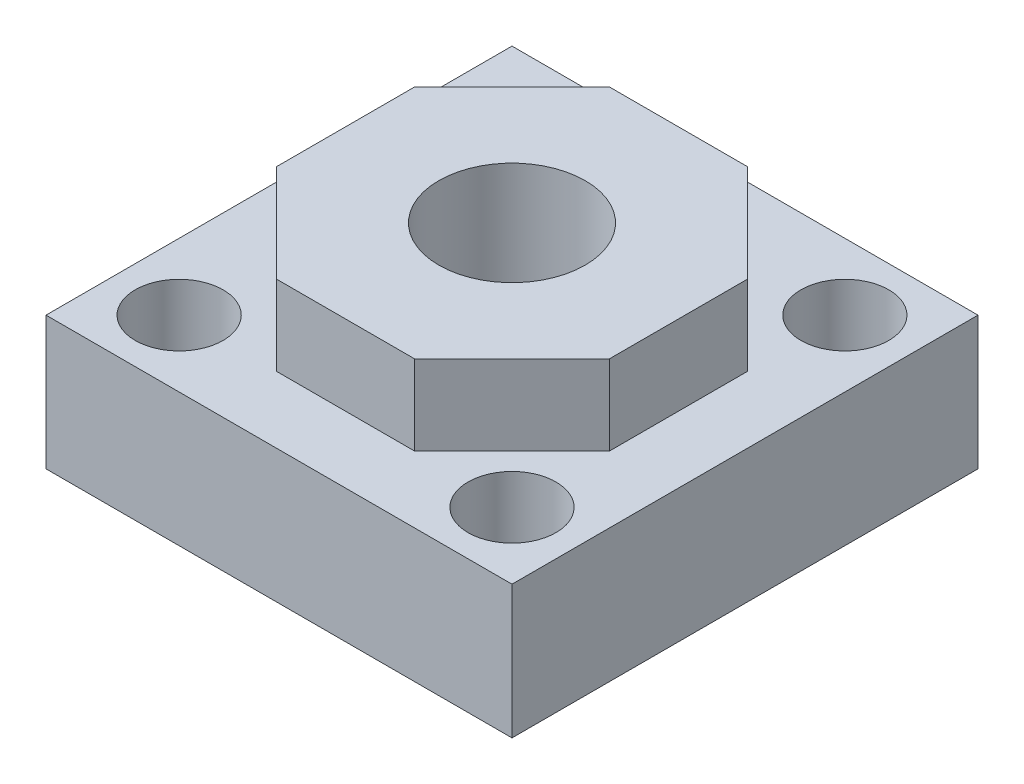
ISO-10303-21;
HEADER;
FILE_DESCRIPTION(('STEP AP214'),'2;1');
FILE_NAME('part.step','',(''),(''),'','','');
FILE_SCHEMA(('AUTOMOTIVE_DESIGN { 1 0 10303 214 1 1 1 1 }'));
ENDSEC;
DATA;
#1=APPLICATION_CONTEXT('core data for automotive mechanical design processes');
#2=APPLICATION_PROTOCOL_DEFINITION('international standard','automotive_design',2000,#1);
#3=PRODUCT_CONTEXT('',#1,'mechanical');
#4=PRODUCT('Part','Part','',(#3));
#5=PRODUCT_RELATED_PRODUCT_CATEGORY('part','',(#4));
#6=PRODUCT_DEFINITION_FORMATION('','',#4);
#7=PRODUCT_DEFINITION_CONTEXT('part definition',#1,'design');
#8=PRODUCT_DEFINITION('design','',#6,#7);
#9=PRODUCT_DEFINITION_SHAPE('','',#8);
#10=(LENGTH_UNIT() NAMED_UNIT(*) SI_UNIT(.MILLI.,.METRE.));
#11=(NAMED_UNIT(*) PLANE_ANGLE_UNIT() SI_UNIT($,.RADIAN.));
#12=(NAMED_UNIT(*) SI_UNIT($,.STERADIAN.) SOLID_ANGLE_UNIT());
#13=UNCERTAINTY_MEASURE_WITH_UNIT(LENGTH_MEASURE(1.E-05),#10,'distance_accuracy_value','');
#14=(GEOMETRIC_REPRESENTATION_CONTEXT(3) GLOBAL_UNCERTAINTY_ASSIGNED_CONTEXT((#13)) GLOBAL_UNIT_ASSIGNED_CONTEXT((#10,
#11,#12)) REPRESENTATION_CONTEXT('',''));
#15=CARTESIAN_POINT('',(0.,0.,0.));
#16=DIRECTION('',(0.,0.,1.));
#17=DIRECTION('',(1.,0.,0.));
#18=AXIS2_PLACEMENT_3D('',#15,#16,#17);
#19=CARTESIAN_POINT('',(17.5,-10.,0.));
#20=DIRECTION('',(-1.,0.,0.));
#21=DIRECTION('',(0.,0.,1.));
#22=AXIS2_PLACEMENT_3D('',#19,#20,#21);
#23=PLANE('',#22);
#24=DIRECTION('',(0.,0.,1.));
#25=VECTOR('',#24,1.);
#26=CARTESIAN_POINT('',(17.5,0.,0.));
#27=LINE('',#26,#25);
#28=CARTESIAN_POINT('',(17.5,0.,-17.5));
#29=VERTEX_POINT('',#28);
#30=CARTESIAN_POINT('',(17.5,0.,17.5));
#31=VERTEX_POINT('',#30);
#32=EDGE_CURVE('E154',#29,#31,#27,.T.);
#33=ORIENTED_EDGE('',*,*,#32,.T.);
#34=DIRECTION('',(0.,1.,0.));
#35=VECTOR('',#34,1.);
#36=CARTESIAN_POINT('',(17.5,-10.,17.5));
#37=LINE('',#36,#35);
#38=CARTESIAN_POINT('',(17.5,-10.,17.5));
#39=VERTEX_POINT('',#38);
#40=EDGE_CURVE('E11',#39,#31,#37,.T.);
#41=ORIENTED_EDGE('',*,*,#40,.F.);
#42=DIRECTION('',(0.,0.,1.));
#43=VECTOR('',#42,1.);
#44=CARTESIAN_POINT('',(17.5,-10.,0.));
#45=LINE('',#44,#43);
#46=CARTESIAN_POINT('',(17.5,-10.,-17.5));
#47=VERTEX_POINT('',#46);
#48=EDGE_CURVE('E163',#47,#39,#45,.T.);
#49=ORIENTED_EDGE('',*,*,#48,.F.);
#50=DIRECTION('',(0.,1.,0.));
#51=VECTOR('',#50,1.);
#52=CARTESIAN_POINT('',(17.5,-10.,-17.5));
#53=LINE('',#52,#51);
#54=EDGE_CURVE('E48',#47,#29,#53,.T.);
#55=ORIENTED_EDGE('',*,*,#54,.T.);
#56=EDGE_LOOP('',(#33,#41,#49,#55));
#57=FACE_BOUND('',#56,.T.);
#58=ADVANCED_FACE('F45',(#57),#23,.F.);
#59=CARTESIAN_POINT('',(0.,-10.,17.5));
#60=DIRECTION('',(0.,0.,1.));
#61=DIRECTION('',(1.,0.,0.));
#62=AXIS2_PLACEMENT_3D('',#59,#60,#61);
#63=PLANE('',#62);
#64=DIRECTION('',(1.,0.,0.));
#65=VECTOR('',#64,1.);
#66=CARTESIAN_POINT('',(0.,0.,17.5));
#67=LINE('',#66,#65);
#68=CARTESIAN_POINT('',(-17.5,0.,17.5));
#69=VERTEX_POINT('',#68);
#70=EDGE_CURVE('E166',#69,#31,#67,.T.);
#71=ORIENTED_EDGE('',*,*,#70,.F.);
#72=DIRECTION('',(0.,1.,0.));
#73=VECTOR('',#72,1.);
#74=CARTESIAN_POINT('',(-17.5,-10.,17.5));
#75=LINE('',#74,#73);
#76=CARTESIAN_POINT('',(-17.5,-10.,17.5));
#77=VERTEX_POINT('',#76);
#78=EDGE_CURVE('E53',#77,#69,#75,.T.);
#79=ORIENTED_EDGE('',*,*,#78,.F.);
#80=DIRECTION('',(1.,0.,0.));
#81=VECTOR('',#80,1.);
#82=CARTESIAN_POINT('',(0.,-10.,17.5));
#83=LINE('',#82,#81);
#84=EDGE_CURVE('E171',#77,#39,#83,.T.);
#85=ORIENTED_EDGE('',*,*,#84,.T.);
#86=ORIENTED_EDGE('',*,*,#40,.T.);
#87=EDGE_LOOP('',(#71,#79,#85,#86));
#88=FACE_BOUND('',#87,.T.);
#89=ADVANCED_FACE('F195',(#88),#63,.T.);
#90=CARTESIAN_POINT('',(-17.5,-10.,0.));
#91=DIRECTION('',(-1.,0.,0.));
#92=DIRECTION('',(0.,0.,1.));
#93=AXIS2_PLACEMENT_3D('',#90,#91,#92);
#94=PLANE('',#93);
#95=DIRECTION('',(0.,0.,1.));
#96=VECTOR('',#95,1.);
#97=CARTESIAN_POINT('',(-17.5,0.,0.));
#98=LINE('',#97,#96);
#99=CARTESIAN_POINT('',(-17.5,0.,-17.5));
#100=VERTEX_POINT('',#99);
#101=EDGE_CURVE('E175',#100,#69,#98,.T.);
#102=ORIENTED_EDGE('',*,*,#101,.F.);
#103=DIRECTION('',(0.,1.,0.));
#104=VECTOR('',#103,1.);
#105=CARTESIAN_POINT('',(-17.5,-10.,-17.5));
#106=LINE('',#105,#104);
#107=CARTESIAN_POINT('',(-17.5,-10.,-17.5));
#108=VERTEX_POINT('',#107);
#109=EDGE_CURVE('E180',#108,#100,#106,.T.);
#110=ORIENTED_EDGE('',*,*,#109,.F.);
#111=DIRECTION('',(0.,0.,1.));
#112=VECTOR('',#111,1.);
#113=CARTESIAN_POINT('',(-17.5,-10.,0.));
#114=LINE('',#113,#112);
#115=EDGE_CURVE('E168',#108,#77,#114,.T.);
#116=ORIENTED_EDGE('',*,*,#115,.T.);
#117=ORIENTED_EDGE('',*,*,#78,.T.);
#118=EDGE_LOOP('',(#102,#110,#116,#117));
#119=FACE_BOUND('',#118,.T.);
#120=ADVANCED_FACE('F202',(#119),#94,.T.);
#121=CARTESIAN_POINT('',(0.,-10.,-17.5));
#122=DIRECTION('',(0.,0.,1.));
#123=DIRECTION('',(1.,0.,0.));
#124=AXIS2_PLACEMENT_3D('',#121,#122,#123);
#125=PLANE('',#124);
#126=DIRECTION('',(1.,0.,0.));
#127=VECTOR('',#126,1.);
#128=CARTESIAN_POINT('',(0.,0.,-17.5));
#129=LINE('',#128,#127);
#130=EDGE_CURVE('E157',#100,#29,#129,.T.);
#131=ORIENTED_EDGE('',*,*,#130,.T.);
#132=ORIENTED_EDGE('',*,*,#54,.F.);
#133=DIRECTION('',(1.,0.,0.));
#134=VECTOR('',#133,1.);
#135=CARTESIAN_POINT('',(0.,-10.,-17.5));
#136=LINE('',#135,#134);
#137=EDGE_CURVE('E165',#108,#47,#136,.T.);
#138=ORIENTED_EDGE('',*,*,#137,.F.);
#139=ORIENTED_EDGE('',*,*,#109,.T.);
#140=EDGE_LOOP('',(#131,#132,#138,#139));
#141=FACE_BOUND('',#140,.T.);
#142=ADVANCED_FACE('F200',(#141),#125,.F.);
#143=CARTESIAN_POINT('',(0.,-10.,0.));
#144=DIRECTION('',(0.,1.,0.));
#145=DIRECTION('',(0.,0.,1.));
#146=AXIS2_PLACEMENT_3D('',#143,#144,#145);
#147=PLANE('',#146);
#148=CARTESIAN_POINT('',(-12.5,-10.,12.5));
#149=DIRECTION('',(0.,1.,0.));
#150=DIRECTION('',(0.,0.,1.));
#151=AXIS2_PLACEMENT_3D('',#148,#149,#150);
#152=CIRCLE('',#151,3.3);
#153=CARTESIAN_POINT('',(-12.5,-10.,15.8));
#154=VERTEX_POINT('',#153);
#155=EDGE_CURVE('E277',#154,#154,#152,.T.);
#156=ORIENTED_EDGE('',*,*,#155,.T.);
#157=EDGE_LOOP('',(#156));
#158=FACE_BOUND('',#157,.T.);
#159=CARTESIAN_POINT('',(12.5,-10.,12.5));
#160=DIRECTION('',(0.,1.,0.));
#161=DIRECTION('',(0.,0.,1.));
#162=AXIS2_PLACEMENT_3D('',#159,#160,#161);
#163=CIRCLE('',#162,3.3);
#164=CARTESIAN_POINT('',(12.5,-10.,15.8));
#165=VERTEX_POINT('',#164);
#166=EDGE_CURVE('E287',#165,#165,#163,.T.);
#167=ORIENTED_EDGE('',*,*,#166,.T.);
#168=EDGE_LOOP('',(#167));
#169=FACE_BOUND('',#168,.T.);
#170=CARTESIAN_POINT('',(12.5,-10.,-12.5));
#171=DIRECTION('',(0.,1.,0.));
#172=DIRECTION('',(0.,0.,1.));
#173=AXIS2_PLACEMENT_3D('',#170,#171,#172);
#174=CIRCLE('',#173,3.3);
#175=CARTESIAN_POINT('',(12.5,-10.,-9.2));
#176=VERTEX_POINT('',#175);
#177=EDGE_CURVE('E293',#176,#176,#174,.T.);
#178=ORIENTED_EDGE('',*,*,#177,.T.);
#179=EDGE_LOOP('',(#178));
#180=FACE_BOUND('',#179,.T.);
#181=CARTESIAN_POINT('',(-12.5,-10.,-12.5));
#182=DIRECTION('',(0.,1.,0.));
#183=DIRECTION('',(0.,0.,1.));
#184=AXIS2_PLACEMENT_3D('',#181,#182,#183);
#185=CIRCLE('',#184,3.3);
#186=CARTESIAN_POINT('',(-12.5,-10.,-9.2));
#187=VERTEX_POINT('',#186);
#188=EDGE_CURVE('E299',#187,#187,#185,.T.);
#189=ORIENTED_EDGE('',*,*,#188,.T.);
#190=EDGE_LOOP('',(#189));
#191=FACE_BOUND('',#190,.T.);
#192=CARTESIAN_POINT('',(0.,-10.,0.));
#193=DIRECTION('',(0.,1.,0.));
#194=DIRECTION('',(0.,0.,1.));
#195=AXIS2_PLACEMENT_3D('',#192,#193,#194);
#196=CIRCLE('',#195,5.5);
#197=CARTESIAN_POINT('',(0.,-10.,5.5));
#198=VERTEX_POINT('',#197);
#199=EDGE_CURVE('E305',#198,#198,#196,.T.);
#200=ORIENTED_EDGE('',*,*,#199,.T.);
#201=EDGE_LOOP('',(#200));
#202=FACE_BOUND('',#201,.T.);
#203=ORIENTED_EDGE('',*,*,#48,.T.);
#204=ORIENTED_EDGE('',*,*,#84,.F.);
#205=ORIENTED_EDGE('',*,*,#115,.F.);
#206=ORIENTED_EDGE('',*,*,#137,.T.);
#207=EDGE_LOOP('',(#203,#204,#205,#206));
#208=FACE_BOUND('',#207,.T.);
#209=ADVANCED_FACE('F199',(#158,#169,#180,#191,#202,#208),#147,.F.);
#210=CARTESIAN_POINT('',(0.,0.,0.));
#211=DIRECTION('',(0.,1.,0.));
#212=DIRECTION('',(0.,0.,1.));
#213=AXIS2_PLACEMENT_3D('',#210,#211,#212);
#214=PLANE('',#213);
#215=CARTESIAN_POINT('',(-12.5,0.,12.5));
#216=DIRECTION('',(0.,1.,0.));
#217=DIRECTION('',(0.,0.,1.));
#218=AXIS2_PLACEMENT_3D('',#215,#216,#217);
#219=CIRCLE('',#218,3.3);
#220=CARTESIAN_POINT('',(-12.5,0.,15.8));
#221=VERTEX_POINT('',#220);
#222=EDGE_CURVE('E280',#221,#221,#219,.T.);
#223=ORIENTED_EDGE('',*,*,#222,.F.);
#224=EDGE_LOOP('',(#223));
#225=FACE_BOUND('',#224,.T.);
#226=CARTESIAN_POINT('',(12.5,0.,12.5));
#227=DIRECTION('',(0.,1.,0.));
#228=DIRECTION('',(0.,0.,1.));
#229=AXIS2_PLACEMENT_3D('',#226,#227,#228);
#230=CIRCLE('',#229,3.3);
#231=CARTESIAN_POINT('',(12.5,0.,15.8));
#232=VERTEX_POINT('',#231);
#233=EDGE_CURVE('E282',#232,#232,#230,.T.);
#234=ORIENTED_EDGE('',*,*,#233,.F.);
#235=EDGE_LOOP('',(#234));
#236=FACE_BOUND('',#235,.T.);
#237=CARTESIAN_POINT('',(12.5,0.,-12.5));
#238=DIRECTION('',(0.,1.,0.));
#239=DIRECTION('',(0.,0.,1.));
#240=AXIS2_PLACEMENT_3D('',#237,#238,#239);
#241=CIRCLE('',#240,3.3);
#242=CARTESIAN_POINT('',(12.5,0.,-9.2));
#243=VERTEX_POINT('',#242);
#244=EDGE_CURVE('E290',#243,#243,#241,.T.);
#245=ORIENTED_EDGE('',*,*,#244,.F.);
#246=EDGE_LOOP('',(#245));
#247=FACE_BOUND('',#246,.T.);
#248=CARTESIAN_POINT('',(-12.5,0.,-12.5));
#249=DIRECTION('',(0.,1.,0.));
#250=DIRECTION('',(0.,0.,1.));
#251=AXIS2_PLACEMENT_3D('',#248,#249,#250);
#252=CIRCLE('',#251,3.3);
#253=CARTESIAN_POINT('',(-12.5,0.,-9.2));
#254=VERTEX_POINT('',#253);
#255=EDGE_CURVE('E296',#254,#254,#252,.T.);
#256=ORIENTED_EDGE('',*,*,#255,.F.);
#257=EDGE_LOOP('',(#256));
#258=FACE_BOUND('',#257,.T.);
#259=DIRECTION('',(0.707106781186548,0.,0.707106781186548));
#260=VECTOR('',#259,1.);
#261=CARTESIAN_POINT('',(-8.83883476483184,0.,8.83883476483184));
#262=LINE('',#261,#260);
#263=CARTESIAN_POINT('',(-12.5,0.,5.17766952966369));
#264=VERTEX_POINT('',#263);
#265=CARTESIAN_POINT('',(-5.17766952966369,0.,12.5));
#266=VERTEX_POINT('',#265);
#267=EDGE_CURVE('E61',#264,#266,#262,.T.);
#268=ORIENTED_EDGE('',*,*,#267,.F.);
#269=DIRECTION('',(0.,0.,1.));
#270=VECTOR('',#269,1.);
#271=CARTESIAN_POINT('',(-12.5,0.,0.));
#272=LINE('',#271,#270);
#273=CARTESIAN_POINT('',(-12.5,0.,-5.17766952966369));
#274=VERTEX_POINT('',#273);
#275=EDGE_CURVE('E65',#274,#264,#272,.T.);
#276=ORIENTED_EDGE('',*,*,#275,.F.);
#277=DIRECTION('',(-0.707106781186547,0.,0.707106781186548));
#278=VECTOR('',#277,1.);
#279=CARTESIAN_POINT('',(-8.83883476483185,0.,-8.83883476483184));
#280=LINE('',#279,#278);
#281=CARTESIAN_POINT('',(-5.17766952966369,0.,-12.5));
#282=VERTEX_POINT('',#281);
#283=EDGE_CURVE('E334',#282,#274,#280,.T.);
#284=ORIENTED_EDGE('',*,*,#283,.F.);
#285=DIRECTION('',(-1.,0.,0.));
#286=VECTOR('',#285,1.);
#287=CARTESIAN_POINT('',(0.,0.,-12.5));
#288=LINE('',#287,#286);
#289=CARTESIAN_POINT('',(5.17766952966369,0.,-12.5));
#290=VERTEX_POINT('',#289);
#291=EDGE_CURVE('E331',#290,#282,#288,.T.);
#292=ORIENTED_EDGE('',*,*,#291,.F.);
#293=DIRECTION('',(-0.707106781186548,0.,-0.707106781186547));
#294=VECTOR('',#293,1.);
#295=CARTESIAN_POINT('',(8.83883476483184,0.,-8.83883476483185));
#296=LINE('',#295,#294);
#297=CARTESIAN_POINT('',(12.5,0.,-5.17766952966369));
#298=VERTEX_POINT('',#297);
#299=EDGE_CURVE('E328',#298,#290,#296,.T.);
#300=ORIENTED_EDGE('',*,*,#299,.F.);
#301=DIRECTION('',(0.,0.,-1.));
#302=VECTOR('',#301,1.);
#303=CARTESIAN_POINT('',(12.5,0.,0.));
#304=LINE('',#303,#302);
#305=CARTESIAN_POINT('',(12.5,0.,5.17766952966368));
#306=VERTEX_POINT('',#305);
#307=EDGE_CURVE('E325',#306,#298,#304,.T.);
#308=ORIENTED_EDGE('',*,*,#307,.F.);
#309=DIRECTION('',(0.707106781186547,0.,-0.707106781186548));
#310=VECTOR('',#309,1.);
#311=CARTESIAN_POINT('',(8.83883476483185,0.,8.83883476483184));
#312=LINE('',#311,#310);
#313=CARTESIAN_POINT('',(5.17766952966369,0.,12.5));
#314=VERTEX_POINT('',#313);
#315=EDGE_CURVE('E322',#314,#306,#312,.T.);
#316=ORIENTED_EDGE('',*,*,#315,.F.);
#317=DIRECTION('',(1.,0.,0.));
#318=VECTOR('',#317,1.);
#319=CARTESIAN_POINT('',(0.,0.,12.5));
#320=LINE('',#319,#318);
#321=EDGE_CURVE('E320',#266,#314,#320,.T.);
#322=ORIENTED_EDGE('',*,*,#321,.F.);
#323=EDGE_LOOP('',(#268,#276,#284,#292,#300,#308,#316,#322));
#324=FACE_BOUND('',#323,.T.);
#325=ORIENTED_EDGE('',*,*,#32,.F.);
#326=ORIENTED_EDGE('',*,*,#130,.F.);
#327=ORIENTED_EDGE('',*,*,#101,.T.);
#328=ORIENTED_EDGE('',*,*,#70,.T.);
#329=EDGE_LOOP('',(#325,#326,#327,#328));
#330=FACE_BOUND('',#329,.T.);
#331=ADVANCED_FACE('F191',(#225,#236,#247,#258,#324,#330),#214,.T.);
#332=CARTESIAN_POINT('',(-8.83883476483184,6.,8.83883476483184));
#333=DIRECTION('',(0.707106781186547,0.,-0.707106781186547));
#334=DIRECTION('',(-0.707106781186548,0.,-0.707106781186548));
#335=AXIS2_PLACEMENT_3D('',#332,#333,#334);
#336=PLANE('',#335);
#337=ORIENTED_EDGE('',*,*,#267,.T.);
#338=DIRECTION('',(0.,-1.,0.));
#339=VECTOR('',#338,1.);
#340=CARTESIAN_POINT('',(-5.17766952966369,6.,12.5));
#341=LINE('',#340,#339);
#342=CARTESIAN_POINT('',(-5.17766952966369,6.,12.5));
#343=VERTEX_POINT('',#342);
#344=EDGE_CURVE('E137',#343,#266,#341,.T.);
#345=ORIENTED_EDGE('',*,*,#344,.F.);
#346=DIRECTION('',(0.707106781186548,0.,0.707106781186548));
#347=VECTOR('',#346,1.);
#348=CARTESIAN_POINT('',(-8.83883476483184,6.,8.83883476483184));
#349=LINE('',#348,#347);
#350=CARTESIAN_POINT('',(-12.5,6.,5.17766952966369));
#351=VERTEX_POINT('',#350);
#352=EDGE_CURVE('E143',#351,#343,#349,.T.);
#353=ORIENTED_EDGE('',*,*,#352,.F.);
#354=DIRECTION('',(0.,-1.,0.));
#355=VECTOR('',#354,1.);
#356=CARTESIAN_POINT('',(-12.5,6.,5.17766952966369));
#357=LINE('',#356,#355);
#358=EDGE_CURVE('E318',#351,#264,#357,.T.);
#359=ORIENTED_EDGE('',*,*,#358,.T.);
#360=EDGE_LOOP('',(#337,#345,#353,#359));
#361=FACE_BOUND('',#360,.T.);
#362=ADVANCED_FACE('F153',(#361),#336,.F.);
#363=CARTESIAN_POINT('',(0.,6.,12.5));
#364=DIRECTION('',(0.,0.,-1.));
#365=DIRECTION('',(-1.,0.,0.));
#366=AXIS2_PLACEMENT_3D('',#363,#364,#365);
#367=PLANE('',#366);
#368=ORIENTED_EDGE('',*,*,#321,.T.);
#369=DIRECTION('',(0.,-1.,0.));
#370=VECTOR('',#369,1.);
#371=CARTESIAN_POINT('',(5.17766952966369,6.,12.5));
#372=LINE('',#371,#370);
#373=CARTESIAN_POINT('',(5.17766952966369,6.,12.5));
#374=VERTEX_POINT('',#373);
#375=EDGE_CURVE('E139',#374,#314,#372,.T.);
#376=ORIENTED_EDGE('',*,*,#375,.F.);
#377=DIRECTION('',(1.,0.,0.));
#378=VECTOR('',#377,1.);
#379=CARTESIAN_POINT('',(0.,6.,12.5));
#380=LINE('',#379,#378);
#381=EDGE_CURVE('E132',#343,#374,#380,.T.);
#382=ORIENTED_EDGE('',*,*,#381,.F.);
#383=ORIENTED_EDGE('',*,*,#344,.T.);
#384=EDGE_LOOP('',(#368,#376,#382,#383));
#385=FACE_BOUND('',#384,.T.);
#386=ADVANCED_FACE('F135',(#385),#367,.F.);
#387=CARTESIAN_POINT('',(8.83883476483185,6.,8.83883476483184));
#388=DIRECTION('',(-0.707106781186548,0.,-0.707106781186547));
#389=DIRECTION('',(-0.707106781186547,0.,0.707106781186548));
#390=AXIS2_PLACEMENT_3D('',#387,#388,#389);
#391=PLANE('',#390);
#392=ORIENTED_EDGE('',*,*,#315,.T.);
#393=DIRECTION('',(0.,-1.,0.));
#394=VECTOR('',#393,1.);
#395=CARTESIAN_POINT('',(12.5,6.,5.17766952966368));
#396=LINE('',#395,#394);
#397=CARTESIAN_POINT('',(12.5,6.,5.17766952966368));
#398=VERTEX_POINT('',#397);
#399=EDGE_CURVE('E159',#398,#306,#396,.T.);
#400=ORIENTED_EDGE('',*,*,#399,.F.);
#401=DIRECTION('',(0.707106781186547,0.,-0.707106781186548));
#402=VECTOR('',#401,1.);
#403=CARTESIAN_POINT('',(8.83883476483185,6.,8.83883476483184));
#404=LINE('',#403,#402);
#405=EDGE_CURVE('E142',#374,#398,#404,.T.);
#406=ORIENTED_EDGE('',*,*,#405,.F.);
#407=ORIENTED_EDGE('',*,*,#375,.T.);
#408=EDGE_LOOP('',(#392,#400,#406,#407));
#409=FACE_BOUND('',#408,.T.);
#410=ADVANCED_FACE('F226',(#409),#391,.F.);
#411=CARTESIAN_POINT('',(12.5,6.,0.));
#412=DIRECTION('',(-1.,0.,0.));
#413=DIRECTION('',(0.,0.,1.));
#414=AXIS2_PLACEMENT_3D('',#411,#412,#413);
#415=PLANE('',#414);
#416=ORIENTED_EDGE('',*,*,#307,.T.);
#417=DIRECTION('',(0.,-1.,0.));
#418=VECTOR('',#417,1.);
#419=CARTESIAN_POINT('',(12.5,6.,-5.17766952966369));
#420=LINE('',#419,#418);
#421=CARTESIAN_POINT('',(12.5,6.,-5.17766952966369));
#422=VERTEX_POINT('',#421);
#423=EDGE_CURVE('E347',#422,#298,#420,.T.);
#424=ORIENTED_EDGE('',*,*,#423,.F.);
#425=DIRECTION('',(0.,0.,-1.));
#426=VECTOR('',#425,1.);
#427=CARTESIAN_POINT('',(12.5,6.,0.));
#428=LINE('',#427,#426);
#429=EDGE_CURVE('E309',#398,#422,#428,.T.);
#430=ORIENTED_EDGE('',*,*,#429,.F.);
#431=ORIENTED_EDGE('',*,*,#399,.T.);
#432=EDGE_LOOP('',(#416,#424,#430,#431));
#433=FACE_BOUND('',#432,.T.);
#434=ADVANCED_FACE('F229',(#433),#415,.F.);
#435=CARTESIAN_POINT('',(8.83883476483184,6.,-8.83883476483185));
#436=DIRECTION('',(-0.707106781186547,0.,0.707106781186548));
#437=DIRECTION('',(0.707106781186548,0.,0.707106781186547));
#438=AXIS2_PLACEMENT_3D('',#435,#436,#437);
#439=PLANE('',#438);
#440=ORIENTED_EDGE('',*,*,#299,.T.);
#441=DIRECTION('',(0.,-1.,0.));
#442=VECTOR('',#441,1.);
#443=CARTESIAN_POINT('',(5.17766952966369,6.,-12.5));
#444=LINE('',#443,#442);
#445=CARTESIAN_POINT('',(5.17766952966369,6.,-12.5));
#446=VERTEX_POINT('',#445);
#447=EDGE_CURVE('E344',#446,#290,#444,.T.);
#448=ORIENTED_EDGE('',*,*,#447,.F.);
#449=DIRECTION('',(-0.707106781186548,0.,-0.707106781186547));
#450=VECTOR('',#449,1.);
#451=CARTESIAN_POINT('',(8.83883476483184,6.,-8.83883476483185));
#452=LINE('',#451,#450);
#453=EDGE_CURVE('E311',#422,#446,#452,.T.);
#454=ORIENTED_EDGE('',*,*,#453,.F.);
#455=ORIENTED_EDGE('',*,*,#423,.T.);
#456=EDGE_LOOP('',(#440,#448,#454,#455));
#457=FACE_BOUND('',#456,.T.);
#458=ADVANCED_FACE('F233',(#457),#439,.F.);
#459=CARTESIAN_POINT('',(0.,6.,-12.5));
#460=DIRECTION('',(0.,0.,1.));
#461=DIRECTION('',(1.,0.,0.));
#462=AXIS2_PLACEMENT_3D('',#459,#460,#461);
#463=PLANE('',#462);
#464=ORIENTED_EDGE('',*,*,#291,.T.);
#465=DIRECTION('',(0.,-1.,0.));
#466=VECTOR('',#465,1.);
#467=CARTESIAN_POINT('',(-5.17766952966369,6.,-12.5));
#468=LINE('',#467,#466);
#469=CARTESIAN_POINT('',(-5.17766952966369,6.,-12.5));
#470=VERTEX_POINT('',#469);
#471=EDGE_CURVE('E341',#470,#282,#468,.T.);
#472=ORIENTED_EDGE('',*,*,#471,.F.);
#473=DIRECTION('',(-1.,0.,0.));
#474=VECTOR('',#473,1.);
#475=CARTESIAN_POINT('',(0.,6.,-12.5));
#476=LINE('',#475,#474);
#477=EDGE_CURVE('E313',#446,#470,#476,.T.);
#478=ORIENTED_EDGE('',*,*,#477,.F.);
#479=ORIENTED_EDGE('',*,*,#447,.T.);
#480=EDGE_LOOP('',(#464,#472,#478,#479));
#481=FACE_BOUND('',#480,.T.);
#482=ADVANCED_FACE('F237',(#481),#463,.F.);
#483=CARTESIAN_POINT('',(-8.83883476483185,6.,-8.83883476483184));
#484=DIRECTION('',(0.707106781186548,0.,0.707106781186547));
#485=DIRECTION('',(0.707106781186547,0.,-0.707106781186548));
#486=AXIS2_PLACEMENT_3D('',#483,#484,#485);
#487=PLANE('',#486);
#488=ORIENTED_EDGE('',*,*,#283,.T.);
#489=DIRECTION('',(0.,-1.,0.));
#490=VECTOR('',#489,1.);
#491=CARTESIAN_POINT('',(-12.5,6.,-5.17766952966369));
#492=LINE('',#491,#490);
#493=CARTESIAN_POINT('',(-12.5,6.,-5.17766952966369));
#494=VERTEX_POINT('',#493);
#495=EDGE_CURVE('E338',#494,#274,#492,.T.);
#496=ORIENTED_EDGE('',*,*,#495,.F.);
#497=DIRECTION('',(-0.707106781186547,0.,0.707106781186548));
#498=VECTOR('',#497,1.);
#499=CARTESIAN_POINT('',(-8.83883476483185,6.,-8.83883476483184));
#500=LINE('',#499,#498);
#501=EDGE_CURVE('E315',#470,#494,#500,.T.);
#502=ORIENTED_EDGE('',*,*,#501,.F.);
#503=ORIENTED_EDGE('',*,*,#471,.T.);
#504=EDGE_LOOP('',(#488,#496,#502,#503));
#505=FACE_BOUND('',#504,.T.);
#506=ADVANCED_FACE('F241',(#505),#487,.F.);
#507=CARTESIAN_POINT('',(-12.5,6.,0.));
#508=DIRECTION('',(1.,0.,0.));
#509=DIRECTION('',(0.,0.,-1.));
#510=AXIS2_PLACEMENT_3D('',#507,#508,#509);
#511=PLANE('',#510);
#512=ORIENTED_EDGE('',*,*,#275,.T.);
#513=ORIENTED_EDGE('',*,*,#358,.F.);
#514=DIRECTION('',(0.,0.,1.));
#515=VECTOR('',#514,1.);
#516=CARTESIAN_POINT('',(-12.5,6.,0.));
#517=LINE('',#516,#515);
#518=EDGE_CURVE('E148',#494,#351,#517,.T.);
#519=ORIENTED_EDGE('',*,*,#518,.F.);
#520=ORIENTED_EDGE('',*,*,#495,.T.);
#521=EDGE_LOOP('',(#512,#513,#519,#520));
#522=FACE_BOUND('',#521,.T.);
#523=ADVANCED_FACE('F245',(#522),#511,.F.);
#524=CARTESIAN_POINT('',(0.,6.,0.));
#525=DIRECTION('',(0.,1.,0.));
#526=DIRECTION('',(0.,0.,1.));
#527=AXIS2_PLACEMENT_3D('',#524,#525,#526);
#528=PLANE('',#527);
#529=CARTESIAN_POINT('',(0.,6.,0.));
#530=DIRECTION('',(0.,1.,0.));
#531=DIRECTION('',(0.,0.,1.));
#532=AXIS2_PLACEMENT_3D('',#529,#530,#531);
#533=CIRCLE('',#532,5.5);
#534=CARTESIAN_POINT('',(0.,6.,5.5));
#535=VERTEX_POINT('',#534);
#536=EDGE_CURVE('E302',#535,#535,#533,.T.);
#537=ORIENTED_EDGE('',*,*,#536,.F.);
#538=EDGE_LOOP('',(#537));
#539=FACE_BOUND('',#538,.T.);
#540=ORIENTED_EDGE('',*,*,#352,.T.);
#541=ORIENTED_EDGE('',*,*,#381,.T.);
#542=ORIENTED_EDGE('',*,*,#405,.T.);
#543=ORIENTED_EDGE('',*,*,#429,.T.);
#544=ORIENTED_EDGE('',*,*,#453,.T.);
#545=ORIENTED_EDGE('',*,*,#477,.T.);
#546=ORIENTED_EDGE('',*,*,#501,.T.);
#547=ORIENTED_EDGE('',*,*,#518,.T.);
#548=EDGE_LOOP('',(#540,#541,#542,#543,#544,#545,#546,#547));
#549=FACE_BOUND('',#548,.T.);
#550=ADVANCED_FACE('F146',(#539,#549),#528,.T.);
#551=CARTESIAN_POINT('',(0.,6.,0.));
#552=DIRECTION('',(0.,1.,0.));
#553=DIRECTION('',(0.,0.,1.));
#554=AXIS2_PLACEMENT_3D('',#551,#552,#553);
#555=CYLINDRICAL_SURFACE('',#554,5.5);
#556=ORIENTED_EDGE('',*,*,#199,.F.);
#557=EDGE_LOOP('',(#556));
#558=FACE_BOUND('',#557,.T.);
#559=ORIENTED_EDGE('',*,*,#536,.T.);
#560=EDGE_LOOP('',(#559));
#561=FACE_BOUND('',#560,.T.);
#562=ADVANCED_FACE('F252',(#558,#561),#555,.F.);
#563=CARTESIAN_POINT('',(-12.5,0.,-12.5));
#564=DIRECTION('',(0.,1.,0.));
#565=DIRECTION('',(0.,0.,1.));
#566=AXIS2_PLACEMENT_3D('',#563,#564,#565);
#567=CYLINDRICAL_SURFACE('',#566,3.3);
#568=ORIENTED_EDGE('',*,*,#188,.F.);
#569=EDGE_LOOP('',(#568));
#570=FACE_BOUND('',#569,.T.);
#571=ORIENTED_EDGE('',*,*,#255,.T.);
#572=EDGE_LOOP('',(#571));
#573=FACE_BOUND('',#572,.T.);
#574=ADVANCED_FACE('F256',(#570,#573),#567,.F.);
#575=CARTESIAN_POINT('',(12.5,0.,-12.5));
#576=DIRECTION('',(0.,1.,0.));
#577=DIRECTION('',(0.,0.,1.));
#578=AXIS2_PLACEMENT_3D('',#575,#576,#577);
#579=CYLINDRICAL_SURFACE('',#578,3.3);
#580=ORIENTED_EDGE('',*,*,#177,.F.);
#581=EDGE_LOOP('',(#580));
#582=FACE_BOUND('',#581,.T.);
#583=ORIENTED_EDGE('',*,*,#244,.T.);
#584=EDGE_LOOP('',(#583));
#585=FACE_BOUND('',#584,.T.);
#586=ADVANCED_FACE('F260',(#582,#585),#579,.F.);
#587=CARTESIAN_POINT('',(12.5,0.,12.5));
#588=DIRECTION('',(0.,1.,0.));
#589=DIRECTION('',(0.,0.,1.));
#590=AXIS2_PLACEMENT_3D('',#587,#588,#589);
#591=CYLINDRICAL_SURFACE('',#590,3.3);
#592=ORIENTED_EDGE('',*,*,#166,.F.);
#593=EDGE_LOOP('',(#592));
#594=FACE_BOUND('',#593,.T.);
#595=ORIENTED_EDGE('',*,*,#233,.T.);
#596=EDGE_LOOP('',(#595));
#597=FACE_BOUND('',#596,.T.);
#598=ADVANCED_FACE('F264',(#594,#597),#591,.F.);
#599=CARTESIAN_POINT('',(-12.5,0.,12.5));
#600=DIRECTION('',(0.,1.,0.));
#601=DIRECTION('',(0.,0.,1.));
#602=AXIS2_PLACEMENT_3D('',#599,#600,#601);
#603=CYLINDRICAL_SURFACE('',#602,3.3);
#604=ORIENTED_EDGE('',*,*,#155,.F.);
#605=EDGE_LOOP('',(#604));
#606=FACE_BOUND('',#605,.T.);
#607=ORIENTED_EDGE('',*,*,#222,.T.);
#608=EDGE_LOOP('',(#607));
#609=FACE_BOUND('',#608,.T.);
#610=ADVANCED_FACE('F268',(#606,#609),#603,.F.);
#611=CLOSED_SHELL('',(#58,#89,#120,#142,#209,#331,#362,#386,#410,#434,#458,#482,#506,#523,#550,
#562,#574,#586,#598,#610));
#612=MANIFOLD_SOLID_BREP('B2',#611);
#613=ADVANCED_BREP_SHAPE_REPRESENTATION('',(#18,#612),#14);
#614=SHAPE_DEFINITION_REPRESENTATION(#9,#613);
ENDSEC;
END-ISO-10303-21;
